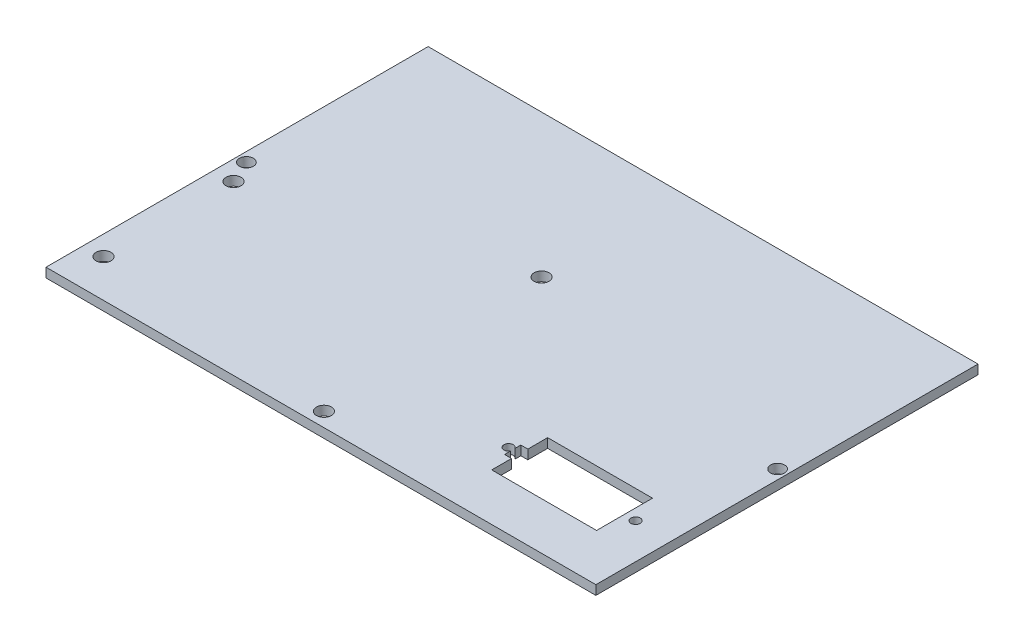
ISO-10303-21;
HEADER;
FILE_DESCRIPTION(('STEP AP214'),'2;1');
FILE_NAME('part.step','',(''),(''),'','','');
FILE_SCHEMA(('AUTOMOTIVE_DESIGN { 1 0 10303 214 1 1 1 1 }'));
ENDSEC;
DATA;
#1=APPLICATION_CONTEXT('core data for automotive mechanical design processes');
#2=APPLICATION_PROTOCOL_DEFINITION('international standard','automotive_design',2000,#1);
#3=PRODUCT_CONTEXT('',#1,'mechanical');
#4=PRODUCT('Part','Part','',(#3));
#5=PRODUCT_RELATED_PRODUCT_CATEGORY('part','',(#4));
#6=PRODUCT_DEFINITION_FORMATION('','',#4);
#7=PRODUCT_DEFINITION_CONTEXT('part definition',#1,'design');
#8=PRODUCT_DEFINITION('design','',#6,#7);
#9=PRODUCT_DEFINITION_SHAPE('','',#8);
#10=(LENGTH_UNIT() NAMED_UNIT(*) SI_UNIT(.MILLI.,.METRE.));
#11=(NAMED_UNIT(*) PLANE_ANGLE_UNIT() SI_UNIT($,.RADIAN.));
#12=(NAMED_UNIT(*) SI_UNIT($,.STERADIAN.) SOLID_ANGLE_UNIT());
#13=UNCERTAINTY_MEASURE_WITH_UNIT(LENGTH_MEASURE(1.E-05),#10,'distance_accuracy_value','');
#14=(GEOMETRIC_REPRESENTATION_CONTEXT(3) GLOBAL_UNCERTAINTY_ASSIGNED_CONTEXT((#13)) GLOBAL_UNIT_ASSIGNED_CONTEXT((#10,
#11,#12)) REPRESENTATION_CONTEXT('',''));
#15=CARTESIAN_POINT('',(0.,0.,0.));
#16=DIRECTION('',(0.,0.,1.));
#17=DIRECTION('',(1.,0.,0.));
#18=AXIS2_PLACEMENT_3D('',#15,#16,#17);
#19=CARTESIAN_POINT('',(0.,2.,0.));
#20=DIRECTION('',(0.,-1.,0.));
#21=DIRECTION('',(0.,0.,-1.));
#22=AXIS2_PLACEMENT_3D('',#19,#20,#21);
#23=PLANE('',#22);
#24=DIRECTION('',(0.,0.,-1.));
#25=VECTOR('',#24,1.);
#26=CARTESIAN_POINT('',(59.,2.,41.));
#27=LINE('',#26,#25);
#28=CARTESIAN_POINT('',(59.,2.,41.));
#29=VERTEX_POINT('',#28);
#30=CARTESIAN_POINT('',(59.,2.,-41.));
#31=VERTEX_POINT('',#30);
#32=EDGE_CURVE('E285',#29,#31,#27,.T.);
#33=ORIENTED_EDGE('',*,*,#32,.T.);
#34=DIRECTION('',(-1.,0.,0.));
#35=VECTOR('',#34,1.);
#36=CARTESIAN_POINT('',(-59.,2.,-41.));
#37=LINE('',#36,#35);
#38=CARTESIAN_POINT('',(-59.,2.,-41.));
#39=VERTEX_POINT('',#38);
#40=EDGE_CURVE('E289',#31,#39,#37,.T.);
#41=ORIENTED_EDGE('',*,*,#40,.T.);
#42=DIRECTION('',(0.,0.,1.));
#43=VECTOR('',#42,1.);
#44=CARTESIAN_POINT('',(-59.,2.,41.));
#45=LINE('',#44,#43);
#46=CARTESIAN_POINT('',(-59.,2.,41.));
#47=VERTEX_POINT('',#46);
#48=EDGE_CURVE('E293',#39,#47,#45,.T.);
#49=ORIENTED_EDGE('',*,*,#48,.T.);
#50=DIRECTION('',(1.,0.,0.));
#51=VECTOR('',#50,1.);
#52=CARTESIAN_POINT('',(-59.,2.,41.));
#53=LINE('',#52,#51);
#54=EDGE_CURVE('E296',#47,#29,#53,.T.);
#55=ORIENTED_EDGE('',*,*,#54,.T.);
#56=EDGE_LOOP('',(#33,#41,#49,#55));
#57=FACE_BOUND('',#56,.T.);
#58=CARTESIAN_POINT('',(57.,2.,0.));
#59=DIRECTION('',(0.,1.,0.));
#60=DIRECTION('',(0.,0.,-1.));
#61=AXIS2_PLACEMENT_3D('',#58,#59,#60);
#62=CIRCLE('',#61,1.5);
#63=CARTESIAN_POINT('',(57.,2.,-1.5));
#64=VERTEX_POINT('',#63);
#65=EDGE_CURVE('E276',#64,#64,#62,.T.);
#66=ORIENTED_EDGE('',*,*,#65,.F.);
#67=EDGE_LOOP('',(#66));
#68=FACE_BOUND('',#67,.T.);
#69=CARTESIAN_POINT('',(-57.,2.,0.));
#70=DIRECTION('',(0.,1.,0.));
#71=DIRECTION('',(0.,0.,1.));
#72=AXIS2_PLACEMENT_3D('',#69,#70,#71);
#73=CIRCLE('',#72,1.5);
#74=CARTESIAN_POINT('',(-57.,2.,1.50000000000001));
#75=VERTEX_POINT('',#74);
#76=EDGE_CURVE('E277',#75,#75,#73,.T.);
#77=ORIENTED_EDGE('',*,*,#76,.F.);
#78=EDGE_LOOP('',(#77));
#79=FACE_BOUND('',#78,.T.);
#80=CARTESIAN_POINT('',(-54.7999999999999,2.,32.8605840268192));
#81=DIRECTION('',(0.,-1.,0.));
#82=DIRECTION('',(0.,0.,-1.));
#83=AXIS2_PLACEMENT_3D('',#80,#81,#82);
#84=CIRCLE('',#83,1.59999999999999);
#85=CARTESIAN_POINT('',(-54.7999999999999,2.,31.2605840268192));
#86=VERTEX_POINT('',#85);
#87=EDGE_CURVE('E248',#86,#86,#84,.T.);
#88=ORIENTED_EDGE('',*,*,#87,.T.);
#89=EDGE_LOOP('',(#88));
#90=FACE_BOUND('',#89,.T.);
#91=CARTESIAN_POINT('',(-3.99999999999997,2.,-10.3394159731808));
#92=DIRECTION('',(0.,-1.,0.));
#93=DIRECTION('',(0.,0.,-1.));
#94=AXIS2_PLACEMENT_3D('',#91,#92,#93);
#95=CIRCLE('',#94,1.6);
#96=CARTESIAN_POINT('',(-3.99999999999997,2.,-11.9394159731808));
#97=VERTEX_POINT('',#96);
#98=EDGE_CURVE('E264',#97,#97,#95,.T.);
#99=ORIENTED_EDGE('',*,*,#98,.T.);
#100=EDGE_LOOP('',(#99));
#101=FACE_BOUND('',#100,.T.);
#102=CARTESIAN_POINT('',(-54.7999999999999,2.,4.9605840268192));
#103=DIRECTION('',(0.,-1.,0.));
#104=DIRECTION('',(0.,0.,-1.));
#105=AXIS2_PLACEMENT_3D('',#102,#103,#104);
#106=CIRCLE('',#105,1.6);
#107=CARTESIAN_POINT('',(-54.7999999999999,2.,3.3605840268192));
#108=VERTEX_POINT('',#107);
#109=EDGE_CURVE('E268',#108,#108,#106,.T.);
#110=ORIENTED_EDGE('',*,*,#109,.T.);
#111=EDGE_LOOP('',(#110));
#112=FACE_BOUND('',#111,.T.);
#113=CARTESIAN_POINT('',(-2.39999999999997,2.,37.9605840268192));
#114=DIRECTION('',(0.,-1.,0.));
#115=DIRECTION('',(0.,0.,-1.));
#116=AXIS2_PLACEMENT_3D('',#113,#114,#115);
#117=CIRCLE('',#116,1.60000000000001);
#118=CARTESIAN_POINT('',(-2.39999999999997,2.,36.3605840268192));
#119=VERTEX_POINT('',#118);
#120=EDGE_CURVE('E272',#119,#119,#117,.T.);
#121=ORIENTED_EDGE('',*,*,#120,.T.);
#122=EDGE_LOOP('',(#121));
#123=FACE_BOUND('',#122,.T.);
#124=CARTESIAN_POINT('',(51.375,2.,24.85));
#125=DIRECTION('',(0.,1.,0.));
#126=DIRECTION('',(0.,0.,1.));
#127=AXIS2_PLACEMENT_3D('',#124,#125,#126);
#128=CIRCLE('',#127,0.999999999999997);
#129=CARTESIAN_POINT('',(51.375,2.,25.85));
#130=VERTEX_POINT('',#129);
#131=EDGE_CURVE('E206',#130,#130,#128,.T.);
#132=ORIENTED_EDGE('',*,*,#131,.F.);
#133=EDGE_LOOP('',(#132));
#134=FACE_BOUND('',#133,.T.);
#135=DIRECTION('',(0.,0.,-1.));
#136=VECTOR('',#135,1.);
#137=CARTESIAN_POINT('',(26.5,2.,30.85));
#138=LINE('',#137,#136);
#139=CARTESIAN_POINT('',(26.5,2.,30.85));
#140=VERTEX_POINT('',#139);
#141=CARTESIAN_POINT('',(26.5,2.,26.6));
#142=VERTEX_POINT('',#141);
#143=EDGE_CURVE('E188',#140,#142,#138,.T.);
#144=ORIENTED_EDGE('',*,*,#143,.T.);
#145=DIRECTION('',(-1.,0.,0.));
#146=VECTOR('',#145,1.);
#147=CARTESIAN_POINT('',(26.5,2.,26.6));
#148=LINE('',#147,#146);
#149=CARTESIAN_POINT('',(25.,2.,26.6));
#150=VERTEX_POINT('',#149);
#151=EDGE_CURVE('E211',#142,#150,#148,.T.);
#152=ORIENTED_EDGE('',*,*,#151,.T.);
#153=DIRECTION('',(0.,0.,1.));
#154=VECTOR('',#153,1.);
#155=CARTESIAN_POINT('',(25.,2.,23.1));
#156=LINE('',#155,#154);
#157=CARTESIAN_POINT('',(25.,2.,25.3341229182759));
#158=VERTEX_POINT('',#157);
#159=EDGE_CURVE('E238',#158,#150,#156,.T.);
#160=ORIENTED_EDGE('',*,*,#159,.F.);
#161=CARTESIAN_POINT('',(24.125,2.,24.85));
#162=DIRECTION('',(0.,1.,0.));
#163=DIRECTION('',(0.,0.,1.));
#164=AXIS2_PLACEMENT_3D('',#161,#162,#163);
#165=CIRCLE('',#164,0.999999999999998);
#166=CARTESIAN_POINT('',(25.,2.,24.3658770817241));
#167=VERTEX_POINT('',#166);
#168=EDGE_CURVE('E70',#167,#158,#165,.T.);
#169=ORIENTED_EDGE('',*,*,#168,.F.);
#170=CARTESIAN_POINT('',(25.,2.,23.1));
#171=VERTEX_POINT('',#170);
#172=EDGE_CURVE('E234',#171,#167,#156,.T.);
#173=ORIENTED_EDGE('',*,*,#172,.F.);
#174=DIRECTION('',(-1.,0.,0.));
#175=VECTOR('',#174,1.);
#176=CARTESIAN_POINT('',(26.5,2.,23.1));
#177=LINE('',#176,#175);
#178=CARTESIAN_POINT('',(26.5,2.,23.1));
#179=VERTEX_POINT('',#178);
#180=EDGE_CURVE('E230',#179,#171,#177,.T.);
#181=ORIENTED_EDGE('',*,*,#180,.F.);
#182=CARTESIAN_POINT('',(26.5,2.,18.85));
#183=VERTEX_POINT('',#182);
#184=EDGE_CURVE('E184',#179,#183,#138,.T.);
#185=ORIENTED_EDGE('',*,*,#184,.T.);
#186=DIRECTION('',(-1.,0.,0.));
#187=VECTOR('',#186,1.);
#188=CARTESIAN_POINT('',(49.,2.,18.85));
#189=LINE('',#188,#187);
#190=CARTESIAN_POINT('',(49.,2.,18.85));
#191=VERTEX_POINT('',#190);
#192=EDGE_CURVE('E162',#191,#183,#189,.T.);
#193=ORIENTED_EDGE('',*,*,#192,.F.);
#194=DIRECTION('',(0.,0.,-1.));
#195=VECTOR('',#194,1.);
#196=CARTESIAN_POINT('',(49.,2.,30.85));
#197=LINE('',#196,#195);
#198=CARTESIAN_POINT('',(49.,2.,30.85));
#199=VERTEX_POINT('',#198);
#200=EDGE_CURVE('E173',#199,#191,#197,.T.);
#201=ORIENTED_EDGE('',*,*,#200,.F.);
#202=DIRECTION('',(-1.,0.,0.));
#203=VECTOR('',#202,1.);
#204=CARTESIAN_POINT('',(49.,2.,30.85));
#205=LINE('',#204,#203);
#206=EDGE_CURVE('E170',#199,#140,#205,.T.);
#207=ORIENTED_EDGE('',*,*,#206,.T.);
#208=EDGE_LOOP('',(#144,#152,#160,#169,#173,#181,#185,#193,#201,#207));
#209=FACE_BOUND('',#208,.T.);
#210=ADVANCED_FACE('F54',(#57,#68,#79,#90,#101,#112,#123,#134,#209),#23,.F.);
#211=CARTESIAN_POINT('',(0.,0.,0.));
#212=DIRECTION('',(0.,-1.,0.));
#213=DIRECTION('',(0.,0.,-1.));
#214=AXIS2_PLACEMENT_3D('',#211,#212,#213);
#215=PLANE('',#214);
#216=CARTESIAN_POINT('',(51.375,0.,24.85));
#217=DIRECTION('',(0.,-1.,0.));
#218=DIRECTION('',(0.,0.,-1.));
#219=AXIS2_PLACEMENT_3D('',#216,#217,#218);
#220=CIRCLE('',#219,0.999999999999997);
#221=CARTESIAN_POINT('',(51.375,0.,23.85));
#222=VERTEX_POINT('',#221);
#223=EDGE_CURVE('E210',#222,#222,#220,.T.);
#224=ORIENTED_EDGE('',*,*,#223,.F.);
#225=EDGE_LOOP('',(#224));
#226=FACE_BOUND('',#225,.T.);
#227=CARTESIAN_POINT('',(-2.39999999999997,0.,37.9605840268192));
#228=DIRECTION('',(0.,-1.,0.));
#229=DIRECTION('',(0.,0.,-1.));
#230=AXIS2_PLACEMENT_3D('',#227,#228,#229);
#231=CIRCLE('',#230,1.60000000000001);
#232=CARTESIAN_POINT('',(-2.39999999999997,0.,36.3605840268192));
#233=VERTEX_POINT('',#232);
#234=EDGE_CURVE('E244',#233,#233,#231,.T.);
#235=ORIENTED_EDGE('',*,*,#234,.F.);
#236=EDGE_LOOP('',(#235));
#237=FACE_BOUND('',#236,.T.);
#238=CARTESIAN_POINT('',(-54.7999999999999,0.,4.9605840268192));
#239=DIRECTION('',(0.,-1.,0.));
#240=DIRECTION('',(0.,0.,-1.));
#241=AXIS2_PLACEMENT_3D('',#238,#239,#240);
#242=CIRCLE('',#241,1.6);
#243=CARTESIAN_POINT('',(-54.7999999999999,0.,3.3605840268192));
#244=VERTEX_POINT('',#243);
#245=EDGE_CURVE('E250',#244,#244,#242,.T.);
#246=ORIENTED_EDGE('',*,*,#245,.F.);
#247=EDGE_LOOP('',(#246));
#248=FACE_BOUND('',#247,.T.);
#249=CARTESIAN_POINT('',(-3.99999999999997,0.,-10.3394159731808));
#250=DIRECTION('',(0.,-1.,0.));
#251=DIRECTION('',(0.,0.,-1.));
#252=AXIS2_PLACEMENT_3D('',#249,#250,#251);
#253=CIRCLE('',#252,1.6);
#254=CARTESIAN_POINT('',(-3.99999999999997,0.,-11.9394159731808));
#255=VERTEX_POINT('',#254);
#256=EDGE_CURVE('E254',#255,#255,#253,.T.);
#257=ORIENTED_EDGE('',*,*,#256,.F.);
#258=EDGE_LOOP('',(#257));
#259=FACE_BOUND('',#258,.T.);
#260=CARTESIAN_POINT('',(-54.7999999999999,0.,32.8605840268192));
#261=DIRECTION('',(0.,-1.,0.));
#262=DIRECTION('',(0.,0.,-1.));
#263=AXIS2_PLACEMENT_3D('',#260,#261,#262);
#264=CIRCLE('',#263,1.59999999999999);
#265=CARTESIAN_POINT('',(-54.7999999999999,0.,31.2605840268192));
#266=VERTEX_POINT('',#265);
#267=EDGE_CURVE('E249',#266,#266,#264,.T.);
#268=ORIENTED_EDGE('',*,*,#267,.F.);
#269=EDGE_LOOP('',(#268));
#270=FACE_BOUND('',#269,.T.);
#271=CARTESIAN_POINT('',(-57.,0.,0.));
#272=DIRECTION('',(0.,-1.,0.));
#273=DIRECTION('',(0.,0.,-1.));
#274=AXIS2_PLACEMENT_3D('',#271,#272,#273);
#275=CIRCLE('',#274,1.5);
#276=CARTESIAN_POINT('',(-57.,0.,-1.5));
#277=VERTEX_POINT('',#276);
#278=EDGE_CURVE('E305',#277,#277,#275,.T.);
#279=ORIENTED_EDGE('',*,*,#278,.F.);
#280=EDGE_LOOP('',(#279));
#281=FACE_BOUND('',#280,.T.);
#282=CARTESIAN_POINT('',(57.,0.,0.));
#283=DIRECTION('',(0.,-1.,0.));
#284=DIRECTION('',(0.,0.,-1.));
#285=AXIS2_PLACEMENT_3D('',#282,#283,#284);
#286=CIRCLE('',#285,1.5);
#287=CARTESIAN_POINT('',(57.,0.,-1.5));
#288=VERTEX_POINT('',#287);
#289=EDGE_CURVE('E281',#288,#288,#286,.T.);
#290=ORIENTED_EDGE('',*,*,#289,.F.);
#291=EDGE_LOOP('',(#290));
#292=FACE_BOUND('',#291,.T.);
#293=DIRECTION('',(0.,0.,-1.));
#294=VECTOR('',#293,1.);
#295=CARTESIAN_POINT('',(59.,0.,41.));
#296=LINE('',#295,#294);
#297=CARTESIAN_POINT('',(59.,0.,41.));
#298=VERTEX_POINT('',#297);
#299=CARTESIAN_POINT('',(59.,0.,-41.));
#300=VERTEX_POINT('',#299);
#301=EDGE_CURVE('E300',#298,#300,#296,.T.);
#302=ORIENTED_EDGE('',*,*,#301,.F.);
#303=DIRECTION('',(1.,0.,0.));
#304=VECTOR('',#303,1.);
#305=CARTESIAN_POINT('',(-59.,0.,41.));
#306=LINE('',#305,#304);
#307=CARTESIAN_POINT('',(-59.,0.,41.));
#308=VERTEX_POINT('',#307);
#309=EDGE_CURVE('E290',#308,#298,#306,.T.);
#310=ORIENTED_EDGE('',*,*,#309,.F.);
#311=DIRECTION('',(0.,0.,1.));
#312=VECTOR('',#311,1.);
#313=CARTESIAN_POINT('',(-59.,0.,41.));
#314=LINE('',#313,#312);
#315=CARTESIAN_POINT('',(-59.,0.,-41.));
#316=VERTEX_POINT('',#315);
#317=EDGE_CURVE('E308',#316,#308,#314,.T.);
#318=ORIENTED_EDGE('',*,*,#317,.F.);
#319=DIRECTION('',(-1.,0.,0.));
#320=VECTOR('',#319,1.);
#321=CARTESIAN_POINT('',(-59.,0.,-41.));
#322=LINE('',#321,#320);
#323=EDGE_CURVE('E304',#300,#316,#322,.T.);
#324=ORIENTED_EDGE('',*,*,#323,.F.);
#325=EDGE_LOOP('',(#302,#310,#318,#324));
#326=FACE_BOUND('',#325,.T.);
#327=DIRECTION('',(1.,0.,0.));
#328=VECTOR('',#327,1.);
#329=CARTESIAN_POINT('',(0.,0.,26.6));
#330=LINE('',#329,#328);
#331=CARTESIAN_POINT('',(25.,0.,26.6));
#332=VERTEX_POINT('',#331);
#333=CARTESIAN_POINT('',(26.5,0.,26.6));
#334=VERTEX_POINT('',#333);
#335=EDGE_CURVE('E337',#332,#334,#330,.T.);
#336=ORIENTED_EDGE('',*,*,#335,.T.);
#337=DIRECTION('',(0.,0.,1.));
#338=VECTOR('',#337,1.);
#339=CARTESIAN_POINT('',(26.5,0.,0.));
#340=LINE('',#339,#338);
#341=CARTESIAN_POINT('',(26.5,0.,30.85));
#342=VERTEX_POINT('',#341);
#343=EDGE_CURVE('E196',#334,#342,#340,.T.);
#344=ORIENTED_EDGE('',*,*,#343,.T.);
#345=DIRECTION('',(1.,0.,0.));
#346=VECTOR('',#345,1.);
#347=CARTESIAN_POINT('',(0.,0.,30.85));
#348=LINE('',#347,#346);
#349=CARTESIAN_POINT('',(49.,0.,30.85));
#350=VERTEX_POINT('',#349);
#351=EDGE_CURVE('E12',#342,#350,#348,.T.);
#352=ORIENTED_EDGE('',*,*,#351,.T.);
#353=DIRECTION('',(0.,0.,1.));
#354=VECTOR('',#353,1.);
#355=CARTESIAN_POINT('',(49.,0.,0.));
#356=LINE('',#355,#354);
#357=CARTESIAN_POINT('',(49.,0.,18.85));
#358=VERTEX_POINT('',#357);
#359=EDGE_CURVE('E63',#358,#350,#356,.T.);
#360=ORIENTED_EDGE('',*,*,#359,.F.);
#361=DIRECTION('',(1.,0.,0.));
#362=VECTOR('',#361,1.);
#363=CARTESIAN_POINT('',(0.,0.,18.85));
#364=LINE('',#363,#362);
#365=CARTESIAN_POINT('',(26.5,0.,18.85));
#366=VERTEX_POINT('',#365);
#367=EDGE_CURVE('E165',#366,#358,#364,.T.);
#368=ORIENTED_EDGE('',*,*,#367,.F.);
#369=CARTESIAN_POINT('',(26.5,0.,23.1));
#370=VERTEX_POINT('',#369);
#371=EDGE_CURVE('E205',#366,#370,#340,.T.);
#372=ORIENTED_EDGE('',*,*,#371,.T.);
#373=DIRECTION('',(1.,0.,0.));
#374=VECTOR('',#373,1.);
#375=CARTESIAN_POINT('',(1.06858966120171E-13,0.,23.1000000000001));
#376=LINE('',#375,#374);
#377=CARTESIAN_POINT('',(25.,0.,23.1));
#378=VERTEX_POINT('',#377);
#379=EDGE_CURVE('E341',#378,#370,#376,.T.);
#380=ORIENTED_EDGE('',*,*,#379,.F.);
#381=DIRECTION('',(0.,0.,-1.));
#382=VECTOR('',#381,1.);
#383=CARTESIAN_POINT('',(25.,0.,0.));
#384=LINE('',#383,#382);
#385=CARTESIAN_POINT('',(25.,0.,24.3658770817241));
#386=VERTEX_POINT('',#385);
#387=EDGE_CURVE('E345',#386,#378,#384,.T.);
#388=ORIENTED_EDGE('',*,*,#387,.F.);
#389=CARTESIAN_POINT('',(24.125,0.,24.85));
#390=DIRECTION('',(0.,-1.,0.));
#391=DIRECTION('',(0.,0.,-1.));
#392=AXIS2_PLACEMENT_3D('',#389,#390,#391);
#393=CIRCLE('',#392,0.999999999999998);
#394=CARTESIAN_POINT('',(25.,0.,25.3341229182759));
#395=VERTEX_POINT('',#394);
#396=EDGE_CURVE('E348',#395,#386,#393,.T.);
#397=ORIENTED_EDGE('',*,*,#396,.F.);
#398=DIRECTION('',(0.,0.,-1.));
#399=VECTOR('',#398,1.);
#400=CARTESIAN_POINT('',(25.,0.,0.));
#401=LINE('',#400,#399);
#402=EDGE_CURVE('E328',#332,#395,#401,.T.);
#403=ORIENTED_EDGE('',*,*,#402,.F.);
#404=EDGE_LOOP('',(#336,#344,#352,#360,#368,#372,#380,#388,#397,#403));
#405=FACE_BOUND('',#404,.T.);
#406=ADVANCED_FACE('F360',(#226,#237,#248,#259,#270,#281,#292,#326,#405),#215,.T.);
#407=CARTESIAN_POINT('',(59.,2.,41.));
#408=DIRECTION('',(-1.,0.,0.));
#409=DIRECTION('',(0.,0.,1.));
#410=AXIS2_PLACEMENT_3D('',#407,#408,#409);
#411=PLANE('',#410);
#412=ORIENTED_EDGE('',*,*,#301,.T.);
#413=DIRECTION('',(0.,-1.,0.));
#414=VECTOR('',#413,1.);
#415=CARTESIAN_POINT('',(59.,2.,-41.));
#416=LINE('',#415,#414);
#417=EDGE_CURVE('E324',#31,#300,#416,.T.);
#418=ORIENTED_EDGE('',*,*,#417,.F.);
#419=ORIENTED_EDGE('',*,*,#32,.F.);
#420=DIRECTION('',(0.,-1.,0.));
#421=VECTOR('',#420,1.);
#422=CARTESIAN_POINT('',(59.,2.,41.));
#423=LINE('',#422,#421);
#424=EDGE_CURVE('E299',#29,#298,#423,.T.);
#425=ORIENTED_EDGE('',*,*,#424,.T.);
#426=EDGE_LOOP('',(#412,#418,#419,#425));
#427=FACE_BOUND('',#426,.T.);
#428=ADVANCED_FACE('F56',(#427),#411,.F.);
#429=CARTESIAN_POINT('',(-59.,2.,-41.));
#430=DIRECTION('',(0.,0.,1.));
#431=DIRECTION('',(1.,0.,0.));
#432=AXIS2_PLACEMENT_3D('',#429,#430,#431);
#433=PLANE('',#432);
#434=ORIENTED_EDGE('',*,*,#323,.T.);
#435=DIRECTION('',(0.,-1.,0.));
#436=VECTOR('',#435,1.);
#437=CARTESIAN_POINT('',(-59.,2.,-41.));
#438=LINE('',#437,#436);
#439=EDGE_CURVE('E320',#39,#316,#438,.T.);
#440=ORIENTED_EDGE('',*,*,#439,.F.);
#441=ORIENTED_EDGE('',*,*,#40,.F.);
#442=ORIENTED_EDGE('',*,*,#417,.T.);
#443=EDGE_LOOP('',(#434,#440,#441,#442));
#444=FACE_BOUND('',#443,.T.);
#445=ADVANCED_FACE('F423',(#444),#433,.F.);
#446=CARTESIAN_POINT('',(-59.,2.,41.));
#447=DIRECTION('',(1.,0.,0.));
#448=DIRECTION('',(0.,0.,-1.));
#449=AXIS2_PLACEMENT_3D('',#446,#447,#448);
#450=PLANE('',#449);
#451=ORIENTED_EDGE('',*,*,#317,.T.);
#452=DIRECTION('',(0.,-1.,0.));
#453=VECTOR('',#452,1.);
#454=CARTESIAN_POINT('',(-59.,2.,41.));
#455=LINE('',#454,#453);
#456=EDGE_CURVE('E316',#47,#308,#455,.T.);
#457=ORIENTED_EDGE('',*,*,#456,.F.);
#458=ORIENTED_EDGE('',*,*,#48,.F.);
#459=ORIENTED_EDGE('',*,*,#439,.T.);
#460=EDGE_LOOP('',(#451,#457,#458,#459));
#461=FACE_BOUND('',#460,.T.);
#462=ADVANCED_FACE('F420',(#461),#450,.F.);
#463=CARTESIAN_POINT('',(-59.,2.,41.));
#464=DIRECTION('',(0.,0.,-1.));
#465=DIRECTION('',(-1.,0.,0.));
#466=AXIS2_PLACEMENT_3D('',#463,#464,#465);
#467=PLANE('',#466);
#468=ORIENTED_EDGE('',*,*,#309,.T.);
#469=ORIENTED_EDGE('',*,*,#424,.F.);
#470=ORIENTED_EDGE('',*,*,#54,.F.);
#471=ORIENTED_EDGE('',*,*,#456,.T.);
#472=EDGE_LOOP('',(#468,#469,#470,#471));
#473=FACE_BOUND('',#472,.T.);
#474=ADVANCED_FACE('F417',(#473),#467,.F.);
#475=CARTESIAN_POINT('',(57.,-8.,0.));
#476=DIRECTION('',(0.,1.,0.));
#477=DIRECTION('',(0.,0.,1.));
#478=AXIS2_PLACEMENT_3D('',#475,#476,#477);
#479=CYLINDRICAL_SURFACE('',#478,1.5);
#480=ORIENTED_EDGE('',*,*,#289,.T.);
#481=EDGE_LOOP('',(#480));
#482=FACE_BOUND('',#481,.T.);
#483=ORIENTED_EDGE('',*,*,#65,.T.);
#484=EDGE_LOOP('',(#483));
#485=FACE_BOUND('',#484,.T.);
#486=ADVANCED_FACE('F414',(#482,#485),#479,.F.);
#487=CARTESIAN_POINT('',(-57.,-8.,0.));
#488=DIRECTION('',(0.,1.,0.));
#489=DIRECTION('',(0.,0.,1.));
#490=AXIS2_PLACEMENT_3D('',#487,#488,#489);
#491=CYLINDRICAL_SURFACE('',#490,1.5);
#492=ORIENTED_EDGE('',*,*,#278,.T.);
#493=EDGE_LOOP('',(#492));
#494=FACE_BOUND('',#493,.T.);
#495=ORIENTED_EDGE('',*,*,#76,.T.);
#496=EDGE_LOOP('',(#495));
#497=FACE_BOUND('',#496,.T.);
#498=ADVANCED_FACE('F469',(#494,#497),#491,.F.);
#499=CARTESIAN_POINT('',(-54.7999999999999,10.,32.8605840268192));
#500=DIRECTION('',(0.,-1.,0.));
#501=DIRECTION('',(0.,0.,-1.));
#502=AXIS2_PLACEMENT_3D('',#499,#500,#501);
#503=CYLINDRICAL_SURFACE('',#502,1.59999999999999);
#504=ORIENTED_EDGE('',*,*,#267,.T.);
#505=EDGE_LOOP('',(#504));
#506=FACE_BOUND('',#505,.T.);
#507=ORIENTED_EDGE('',*,*,#87,.F.);
#508=EDGE_LOOP('',(#507));
#509=FACE_BOUND('',#508,.T.);
#510=ADVANCED_FACE('F478',(#506,#509),#503,.F.);
#511=CARTESIAN_POINT('',(-3.99999999999997,10.,-10.3394159731808));
#512=DIRECTION('',(0.,-1.,0.));
#513=DIRECTION('',(0.,0.,-1.));
#514=AXIS2_PLACEMENT_3D('',#511,#512,#513);
#515=CYLINDRICAL_SURFACE('',#514,1.6);
#516=ORIENTED_EDGE('',*,*,#256,.T.);
#517=EDGE_LOOP('',(#516));
#518=FACE_BOUND('',#517,.T.);
#519=ORIENTED_EDGE('',*,*,#98,.F.);
#520=EDGE_LOOP('',(#519));
#521=FACE_BOUND('',#520,.T.);
#522=ADVANCED_FACE('F487',(#518,#521),#515,.F.);
#523=CARTESIAN_POINT('',(-54.7999999999999,10.,4.9605840268192));
#524=DIRECTION('',(0.,-1.,0.));
#525=DIRECTION('',(0.,0.,-1.));
#526=AXIS2_PLACEMENT_3D('',#523,#524,#525);
#527=CYLINDRICAL_SURFACE('',#526,1.6);
#528=ORIENTED_EDGE('',*,*,#245,.T.);
#529=EDGE_LOOP('',(#528));
#530=FACE_BOUND('',#529,.T.);
#531=ORIENTED_EDGE('',*,*,#109,.F.);
#532=EDGE_LOOP('',(#531));
#533=FACE_BOUND('',#532,.T.);
#534=ADVANCED_FACE('F497',(#530,#533),#527,.F.);
#535=CARTESIAN_POINT('',(-2.39999999999997,10.,37.9605840268192));
#536=DIRECTION('',(0.,-1.,0.));
#537=DIRECTION('',(0.,0.,-1.));
#538=AXIS2_PLACEMENT_3D('',#535,#536,#537);
#539=CYLINDRICAL_SURFACE('',#538,1.60000000000001);
#540=ORIENTED_EDGE('',*,*,#234,.T.);
#541=EDGE_LOOP('',(#540));
#542=FACE_BOUND('',#541,.T.);
#543=ORIENTED_EDGE('',*,*,#120,.F.);
#544=EDGE_LOOP('',(#543));
#545=FACE_BOUND('',#544,.T.);
#546=ADVANCED_FACE('F401',(#542,#545),#539,.F.);
#547=CARTESIAN_POINT('',(24.125,-8.,24.85));
#548=DIRECTION('',(0.,1.,0.));
#549=DIRECTION('',(0.,0.,1.));
#550=AXIS2_PLACEMENT_3D('',#547,#548,#549);
#551=CYLINDRICAL_SURFACE('',#550,0.999999999999998);
#552=ORIENTED_EDGE('',*,*,#396,.T.);
#553=DIRECTION('',(0.,1.,0.));
#554=VECTOR('',#553,1.);
#555=CARTESIAN_POINT('',(25.,-8.,24.3658770817241));
#556=LINE('',#555,#554);
#557=EDGE_CURVE('E215',#386,#167,#556,.T.);
#558=ORIENTED_EDGE('',*,*,#557,.T.);
#559=ORIENTED_EDGE('',*,*,#168,.T.);
#560=DIRECTION('',(0.,1.,0.));
#561=VECTOR('',#560,1.);
#562=CARTESIAN_POINT('',(25.,-8.,25.3341229182759));
#563=LINE('',#562,#561);
#564=EDGE_CURVE('E212',#158,#395,#563,.F.);
#565=ORIENTED_EDGE('',*,*,#564,.T.);
#566=EDGE_LOOP('',(#552,#558,#559,#565));
#567=FACE_BOUND('',#566,.T.);
#568=ADVANCED_FACE('F384',(#567),#551,.F.);
#569=CARTESIAN_POINT('',(25.,-8.,23.1));
#570=DIRECTION('',(-1.,0.,0.));
#571=DIRECTION('',(0.,0.,1.));
#572=AXIS2_PLACEMENT_3D('',#569,#570,#571);
#573=PLANE('',#572);
#574=ORIENTED_EDGE('',*,*,#387,.T.);
#575=DIRECTION('',(0.,1.,0.));
#576=VECTOR('',#575,1.);
#577=CARTESIAN_POINT('',(25.,-8.,23.1));
#578=LINE('',#577,#576);
#579=EDGE_CURVE('E220',#378,#171,#578,.T.);
#580=ORIENTED_EDGE('',*,*,#579,.T.);
#581=ORIENTED_EDGE('',*,*,#172,.T.);
#582=ORIENTED_EDGE('',*,*,#557,.F.);
#583=EDGE_LOOP('',(#574,#580,#581,#582));
#584=FACE_BOUND('',#583,.T.);
#585=ADVANCED_FACE('F381',(#584),#573,.F.);
#586=CARTESIAN_POINT('',(26.5,-8.,23.1));
#587=DIRECTION('',(0.,0.,-1.));
#588=DIRECTION('',(-1.,0.,0.));
#589=AXIS2_PLACEMENT_3D('',#586,#587,#588);
#590=PLANE('',#589);
#591=ORIENTED_EDGE('',*,*,#379,.T.);
#592=DIRECTION('',(0.,1.,0.));
#593=VECTOR('',#592,1.);
#594=CARTESIAN_POINT('',(26.5,-8.,23.1));
#595=LINE('',#594,#593);
#596=EDGE_CURVE('E223',#370,#179,#595,.T.);
#597=ORIENTED_EDGE('',*,*,#596,.T.);
#598=ORIENTED_EDGE('',*,*,#180,.T.);
#599=ORIENTED_EDGE('',*,*,#579,.F.);
#600=EDGE_LOOP('',(#591,#597,#598,#599));
#601=FACE_BOUND('',#600,.T.);
#602=ADVANCED_FACE('F379',(#601),#590,.F.);
#603=CARTESIAN_POINT('',(26.5,-8.,26.6));
#604=DIRECTION('',(0.,0.,-1.));
#605=DIRECTION('',(-1.,0.,0.));
#606=AXIS2_PLACEMENT_3D('',#603,#604,#605);
#607=PLANE('',#606);
#608=DIRECTION('',(0.,1.,0.));
#609=VECTOR('',#608,1.);
#610=CARTESIAN_POINT('',(25.,-8.,26.6));
#611=LINE('',#610,#609);
#612=EDGE_CURVE('E78',#332,#150,#611,.T.);
#613=ORIENTED_EDGE('',*,*,#612,.T.);
#614=ORIENTED_EDGE('',*,*,#151,.F.);
#615=DIRECTION('',(0.,1.,0.));
#616=VECTOR('',#615,1.);
#617=CARTESIAN_POINT('',(26.5,-8.,26.6));
#618=LINE('',#617,#616);
#619=EDGE_CURVE('E227',#334,#142,#618,.T.);
#620=ORIENTED_EDGE('',*,*,#619,.F.);
#621=ORIENTED_EDGE('',*,*,#335,.F.);
#622=EDGE_LOOP('',(#613,#614,#620,#621));
#623=FACE_BOUND('',#622,.T.);
#624=ADVANCED_FACE('F368',(#623),#607,.T.);
#625=ORIENTED_EDGE('',*,*,#402,.T.);
#626=ORIENTED_EDGE('',*,*,#564,.F.);
#627=ORIENTED_EDGE('',*,*,#159,.T.);
#628=ORIENTED_EDGE('',*,*,#612,.F.);
#629=EDGE_LOOP('',(#625,#626,#627,#628));
#630=FACE_BOUND('',#629,.T.);
#631=ADVANCED_FACE('F385',(#630),#573,.F.);
#632=CARTESIAN_POINT('',(51.375,-8.,24.85));
#633=DIRECTION('',(0.,1.,0.));
#634=DIRECTION('',(0.,0.,1.));
#635=AXIS2_PLACEMENT_3D('',#632,#633,#634);
#636=CYLINDRICAL_SURFACE('',#635,0.999999999999997);
#637=ORIENTED_EDGE('',*,*,#223,.T.);
#638=EDGE_LOOP('',(#637));
#639=FACE_BOUND('',#638,.T.);
#640=ORIENTED_EDGE('',*,*,#131,.T.);
#641=EDGE_LOOP('',(#640));
#642=FACE_BOUND('',#641,.T.);
#643=ADVANCED_FACE('F387',(#639,#642),#636,.F.);
#644=CARTESIAN_POINT('',(26.5,-8.,30.85));
#645=DIRECTION('',(1.,0.,0.));
#646=DIRECTION('',(0.,0.,-1.));
#647=AXIS2_PLACEMENT_3D('',#644,#645,#646);
#648=PLANE('',#647);
#649=DIRECTION('',(0.,1.,0.));
#650=VECTOR('',#649,1.);
#651=CARTESIAN_POINT('',(26.5,-8.,18.85));
#652=LINE('',#651,#650);
#653=EDGE_CURVE('E169',#366,#183,#652,.T.);
#654=ORIENTED_EDGE('',*,*,#653,.T.);
#655=ORIENTED_EDGE('',*,*,#184,.F.);
#656=ORIENTED_EDGE('',*,*,#596,.F.);
#657=ORIENTED_EDGE('',*,*,#371,.F.);
#658=EDGE_LOOP('',(#654,#655,#656,#657));
#659=FACE_BOUND('',#658,.T.);
#660=ADVANCED_FACE('F393',(#659),#648,.T.);
#661=CARTESIAN_POINT('',(49.,-8.,30.85));
#662=DIRECTION('',(1.,0.,0.));
#663=DIRECTION('',(0.,0.,-1.));
#664=AXIS2_PLACEMENT_3D('',#661,#662,#663);
#665=PLANE('',#664);
#666=ORIENTED_EDGE('',*,*,#359,.T.);
#667=DIRECTION('',(0.,1.,0.));
#668=VECTOR('',#667,1.);
#669=CARTESIAN_POINT('',(49.,-8.,30.85));
#670=LINE('',#669,#668);
#671=EDGE_CURVE('E176',#350,#199,#670,.T.);
#672=ORIENTED_EDGE('',*,*,#671,.T.);
#673=ORIENTED_EDGE('',*,*,#200,.T.);
#674=DIRECTION('',(0.,1.,0.));
#675=VECTOR('',#674,1.);
#676=CARTESIAN_POINT('',(49.,-8.,18.85));
#677=LINE('',#676,#675);
#678=EDGE_CURVE('E157',#358,#191,#677,.T.);
#679=ORIENTED_EDGE('',*,*,#678,.F.);
#680=EDGE_LOOP('',(#666,#672,#673,#679));
#681=FACE_BOUND('',#680,.T.);
#682=ADVANCED_FACE('F174',(#681),#665,.F.);
#683=CARTESIAN_POINT('',(49.,-8.,30.85));
#684=DIRECTION('',(0.,0.,-1.));
#685=DIRECTION('',(-1.,0.,0.));
#686=AXIS2_PLACEMENT_3D('',#683,#684,#685);
#687=PLANE('',#686);
#688=DIRECTION('',(0.,1.,0.));
#689=VECTOR('',#688,1.);
#690=CARTESIAN_POINT('',(26.5,-8.,30.85));
#691=LINE('',#690,#689);
#692=EDGE_CURVE('E197',#342,#140,#691,.T.);
#693=ORIENTED_EDGE('',*,*,#692,.T.);
#694=ORIENTED_EDGE('',*,*,#206,.F.);
#695=ORIENTED_EDGE('',*,*,#671,.F.);
#696=ORIENTED_EDGE('',*,*,#351,.F.);
#697=EDGE_LOOP('',(#693,#694,#695,#696));
#698=FACE_BOUND('',#697,.T.);
#699=ADVANCED_FACE('F358',(#698),#687,.T.);
#700=ORIENTED_EDGE('',*,*,#619,.T.);
#701=ORIENTED_EDGE('',*,*,#143,.F.);
#702=ORIENTED_EDGE('',*,*,#692,.F.);
#703=ORIENTED_EDGE('',*,*,#343,.F.);
#704=EDGE_LOOP('',(#700,#701,#702,#703));
#705=FACE_BOUND('',#704,.T.);
#706=ADVANCED_FACE('F364',(#705),#648,.T.);
#707=CARTESIAN_POINT('',(49.,-8.,18.85));
#708=DIRECTION('',(0.,0.,-1.));
#709=DIRECTION('',(-1.,0.,0.));
#710=AXIS2_PLACEMENT_3D('',#707,#708,#709);
#711=PLANE('',#710);
#712=ORIENTED_EDGE('',*,*,#367,.T.);
#713=ORIENTED_EDGE('',*,*,#678,.T.);
#714=ORIENTED_EDGE('',*,*,#192,.T.);
#715=ORIENTED_EDGE('',*,*,#653,.F.);
#716=EDGE_LOOP('',(#712,#713,#714,#715));
#717=FACE_BOUND('',#716,.T.);
#718=ADVANCED_FACE('F159',(#717),#711,.F.);
#719=CLOSED_SHELL('',(#210,#406,#428,#445,#462,#474,#486,#498,#510,#522,#534,#546,#568,#585,
#602,#624,#631,#643,#660,#682,#699,#706,#718));
#720=MANIFOLD_SOLID_BREP('B2',#719);
#721=ADVANCED_BREP_SHAPE_REPRESENTATION('',(#18,#720),#14);
#722=SHAPE_DEFINITION_REPRESENTATION(#9,#721);
ENDSEC;
END-ISO-10303-21;
